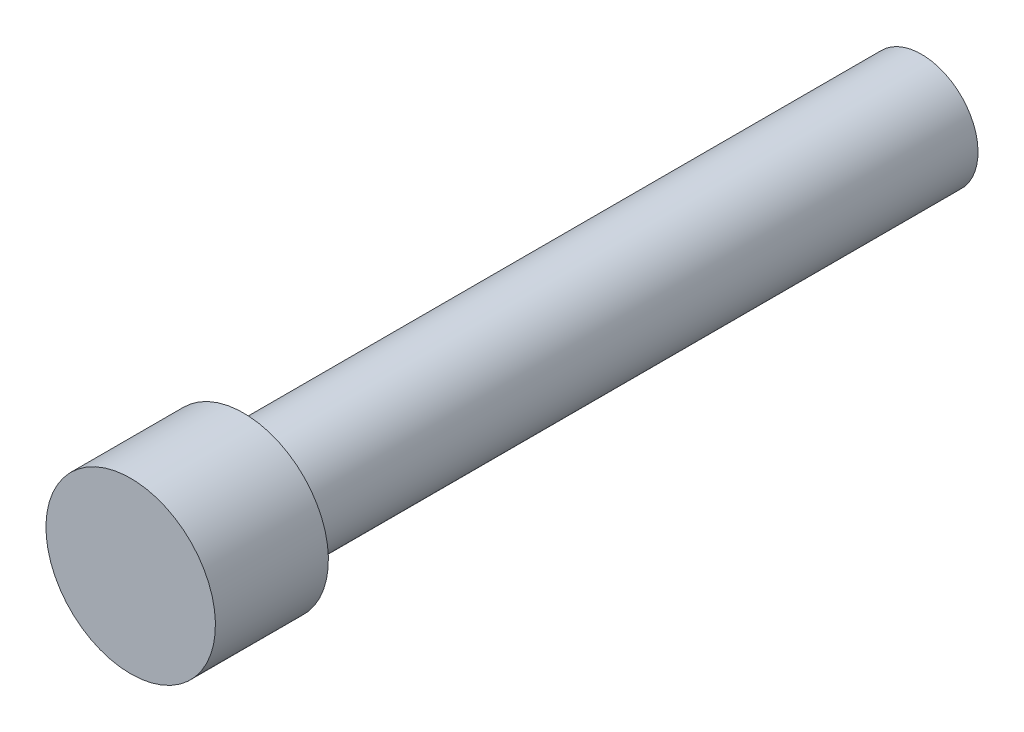
ISO-10303-21;
HEADER;
FILE_DESCRIPTION(('STEP AP214'),'2;1');
FILE_NAME('part.step','',(''),(''),'','','');
FILE_SCHEMA(('AUTOMOTIVE_DESIGN { 1 0 10303 214 1 1 1 1 }'));
ENDSEC;
DATA;
#1=APPLICATION_CONTEXT('core data for automotive mechanical design processes');
#2=APPLICATION_PROTOCOL_DEFINITION('international standard','automotive_design',2000,#1);
#3=PRODUCT_CONTEXT('',#1,'mechanical');
#4=PRODUCT('Part','Part','',(#3));
#5=PRODUCT_RELATED_PRODUCT_CATEGORY('part','',(#4));
#6=PRODUCT_DEFINITION_FORMATION('','',#4);
#7=PRODUCT_DEFINITION_CONTEXT('part definition',#1,'design');
#8=PRODUCT_DEFINITION('design','',#6,#7);
#9=PRODUCT_DEFINITION_SHAPE('','',#8);
#10=(LENGTH_UNIT() NAMED_UNIT(*) SI_UNIT(.MILLI.,.METRE.));
#11=(NAMED_UNIT(*) PLANE_ANGLE_UNIT() SI_UNIT($,.RADIAN.));
#12=(NAMED_UNIT(*) SI_UNIT($,.STERADIAN.) SOLID_ANGLE_UNIT());
#13=UNCERTAINTY_MEASURE_WITH_UNIT(LENGTH_MEASURE(1.E-05),#10,'distance_accuracy_value','');
#14=(GEOMETRIC_REPRESENTATION_CONTEXT(3) GLOBAL_UNCERTAINTY_ASSIGNED_CONTEXT((#13)) GLOBAL_UNIT_ASSIGNED_CONTEXT((#10,
#11,#12)) REPRESENTATION_CONTEXT('',''));
#15=CARTESIAN_POINT('',(0.,0.,0.));
#16=DIRECTION('',(0.,0.,1.));
#17=DIRECTION('',(1.,0.,0.));
#18=AXIS2_PLACEMENT_3D('',#15,#16,#17);
#19=CARTESIAN_POINT('',(0.,0.,22.225));
#20=DIRECTION('',(0.,0.,1.));
#21=DIRECTION('',(0.,-1.,0.));
#22=AXIS2_PLACEMENT_3D('',#19,#20,#21);
#23=CYLINDRICAL_SURFACE('',#22,4.7625);
#24=CARTESIAN_POINT('',(0.,0.,22.225));
#25=DIRECTION('',(0.,0.,1.));
#26=DIRECTION('',(0.,-1.,0.));
#27=AXIS2_PLACEMENT_3D('',#24,#25,#26);
#28=CIRCLE('',#27,4.7625);
#29=CARTESIAN_POINT('',(0.,-4.76249999999999,22.225));
#30=VERTEX_POINT('',#29);
#31=EDGE_CURVE('E10',#30,#30,#28,.T.);
#32=ORIENTED_EDGE('',*,*,#31,.F.);
#33=EDGE_LOOP('',(#32));
#34=FACE_BOUND('',#33,.T.);
#35=CARTESIAN_POINT('',(0.,0.,15.875));
#36=DIRECTION('',(0.,0.,1.));
#37=DIRECTION('',(0.,-1.,0.));
#38=AXIS2_PLACEMENT_3D('',#35,#36,#37);
#39=CIRCLE('',#38,4.7625);
#40=CARTESIAN_POINT('',(0.,-4.76249999999999,15.875));
#41=VERTEX_POINT('',#40);
#42=EDGE_CURVE('E55',#41,#41,#39,.T.);
#43=ORIENTED_EDGE('',*,*,#42,.T.);
#44=EDGE_LOOP('',(#43));
#45=FACE_BOUND('',#44,.T.);
#46=ADVANCED_FACE('F41',(#34,#45),#23,.T.);
#47=CARTESIAN_POINT('',(0.,4.7625,22.225));
#48=DIRECTION('',(0.,0.,-1.));
#49=DIRECTION('',(0.,1.,0.));
#50=AXIS2_PLACEMENT_3D('',#47,#48,#49);
#51=PLANE('',#50);
#52=ORIENTED_EDGE('',*,*,#31,.T.);
#53=EDGE_LOOP('',(#52));
#54=FACE_BOUND('',#53,.T.);
#55=ADVANCED_FACE('F75',(#54),#51,.F.);
#56=CARTESIAN_POINT('',(0.,0.,-22.225));
#57=DIRECTION('',(0.,0.,1.));
#58=DIRECTION('',(0.,-1.,0.));
#59=AXIS2_PLACEMENT_3D('',#56,#57,#58);
#60=PLANE('',#59);
#61=CARTESIAN_POINT('',(0.,0.,-22.225));
#62=DIRECTION('',(0.,0.,1.));
#63=DIRECTION('',(0.,-1.,0.));
#64=AXIS2_PLACEMENT_3D('',#61,#62,#63);
#65=CIRCLE('',#64,3.17499999999999);
#66=CARTESIAN_POINT('',(0.,-3.17499999999999,-22.225));
#67=VERTEX_POINT('',#66);
#68=EDGE_CURVE('E47',#67,#67,#65,.T.);
#69=ORIENTED_EDGE('',*,*,#68,.F.);
#70=EDGE_LOOP('',(#69));
#71=FACE_BOUND('',#70,.T.);
#72=ADVANCED_FACE('F70',(#71),#60,.F.);
#73=CARTESIAN_POINT('',(0.,0.,22.225));
#74=DIRECTION('',(0.,0.,1.));
#75=DIRECTION('',(0.,-1.,0.));
#76=AXIS2_PLACEMENT_3D('',#73,#74,#75);
#77=CYLINDRICAL_SURFACE('',#76,3.17499999999999);
#78=CARTESIAN_POINT('',(0.,0.,15.875));
#79=DIRECTION('',(0.,0.,1.));
#80=DIRECTION('',(0.,-1.,0.));
#81=AXIS2_PLACEMENT_3D('',#78,#79,#80);
#82=CIRCLE('',#81,3.17499999999999);
#83=CARTESIAN_POINT('',(0.,-3.17499999999998,15.875));
#84=VERTEX_POINT('',#83);
#85=EDGE_CURVE('E51',#84,#84,#82,.T.);
#86=ORIENTED_EDGE('',*,*,#85,.F.);
#87=EDGE_LOOP('',(#86));
#88=FACE_BOUND('',#87,.T.);
#89=ORIENTED_EDGE('',*,*,#68,.T.);
#90=EDGE_LOOP('',(#89));
#91=FACE_BOUND('',#90,.T.);
#92=ADVANCED_FACE('F65',(#88,#91),#77,.T.);
#93=CARTESIAN_POINT('',(0.,3.17499999999999,15.875));
#94=DIRECTION('',(0.,0.,1.));
#95=DIRECTION('',(0.,-1.,0.));
#96=AXIS2_PLACEMENT_3D('',#93,#94,#95);
#97=PLANE('',#96);
#98=ORIENTED_EDGE('',*,*,#42,.F.);
#99=EDGE_LOOP('',(#98));
#100=FACE_BOUND('',#99,.T.);
#101=ORIENTED_EDGE('',*,*,#85,.T.);
#102=EDGE_LOOP('',(#101));
#103=FACE_BOUND('',#102,.T.);
#104=ADVANCED_FACE('F62',(#100,#103),#97,.F.);
#105=CLOSED_SHELL('',(#46,#55,#72,#92,#104));
#106=MANIFOLD_SOLID_BREP('B2',#105);
#107=ADVANCED_BREP_SHAPE_REPRESENTATION('',(#18,#106),#14);
#108=SHAPE_DEFINITION_REPRESENTATION(#9,#107);
ENDSEC;
END-ISO-10303-21;
